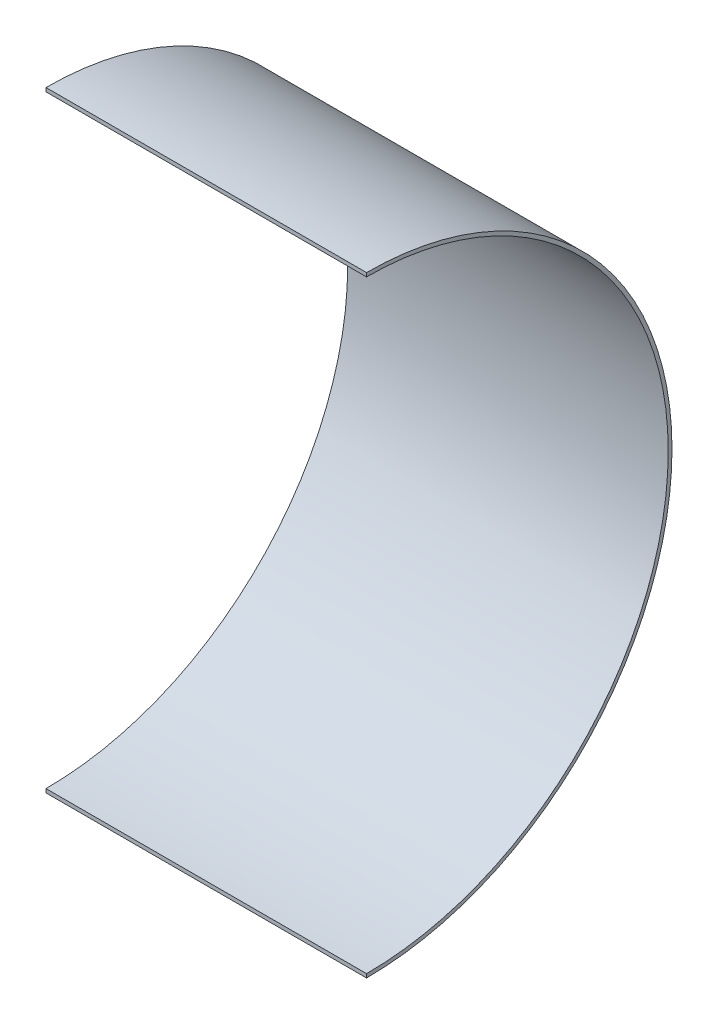
ISO-10303-21;
HEADER;
FILE_DESCRIPTION(('STEP AP214'),'2;1');
FILE_NAME('part.step','',(''),(''),'','','');
FILE_SCHEMA(('AUTOMOTIVE_DESIGN { 1 0 10303 214 1 1 1 1 }'));
ENDSEC;
DATA;
#1=APPLICATION_CONTEXT('core data for automotive mechanical design processes');
#2=APPLICATION_PROTOCOL_DEFINITION('international standard','automotive_design',2000,#1);
#3=PRODUCT_CONTEXT('',#1,'mechanical');
#4=PRODUCT('Part','Part','',(#3));
#5=PRODUCT_RELATED_PRODUCT_CATEGORY('part','',(#4));
#6=PRODUCT_DEFINITION_FORMATION('','',#4);
#7=PRODUCT_DEFINITION_CONTEXT('part definition',#1,'design');
#8=PRODUCT_DEFINITION('design','',#6,#7);
#9=PRODUCT_DEFINITION_SHAPE('','',#8);
#10=(LENGTH_UNIT() NAMED_UNIT(*) SI_UNIT(.MILLI.,.METRE.));
#11=(NAMED_UNIT(*) PLANE_ANGLE_UNIT() SI_UNIT($,.RADIAN.));
#12=(NAMED_UNIT(*) SI_UNIT($,.STERADIAN.) SOLID_ANGLE_UNIT());
#13=UNCERTAINTY_MEASURE_WITH_UNIT(LENGTH_MEASURE(1.E-05),#10,'distance_accuracy_value','');
#14=(GEOMETRIC_REPRESENTATION_CONTEXT(3) GLOBAL_UNCERTAINTY_ASSIGNED_CONTEXT((#13)) GLOBAL_UNIT_ASSIGNED_CONTEXT((#10,
#11,#12)) REPRESENTATION_CONTEXT('',''));
#15=CARTESIAN_POINT('',(0.,0.,0.));
#16=DIRECTION('',(0.,0.,1.));
#17=DIRECTION('',(1.,0.,0.));
#18=AXIS2_PLACEMENT_3D('',#15,#16,#17);
#19=CARTESIAN_POINT('',(215.9,0.,0.));
#20=DIRECTION('',(-1.,0.,0.));
#21=DIRECTION('',(0.,0.,1.));
#22=AXIS2_PLACEMENT_3D('',#19,#20,#21);
#23=CYLINDRICAL_SURFACE('',#22,205.74);
#24=CARTESIAN_POINT('',(0.,0.,0.));
#25=DIRECTION('',(1.,0.,0.));
#26=DIRECTION('',(0.,0.,-1.));
#27=AXIS2_PLACEMENT_3D('',#24,#25,#26);
#28=CIRCLE('',#27,205.74);
#29=CARTESIAN_POINT('',(0.,-205.74,0.));
#30=VERTEX_POINT('',#29);
#31=CARTESIAN_POINT('',(0.,205.74,0.));
#32=VERTEX_POINT('',#31);
#33=EDGE_CURVE('E95',#30,#32,#28,.T.);
#34=ORIENTED_EDGE('',*,*,#33,.T.);
#35=DIRECTION('',(-1.,0.,0.));
#36=VECTOR('',#35,1.);
#37=CARTESIAN_POINT('',(215.9,205.74,0.));
#38=LINE('',#37,#36);
#39=CARTESIAN_POINT('',(215.9,205.74,0.));
#40=VERTEX_POINT('',#39);
#41=EDGE_CURVE('E11',#40,#32,#38,.T.);
#42=ORIENTED_EDGE('',*,*,#41,.F.);
#43=CARTESIAN_POINT('',(215.9,0.,0.));
#44=DIRECTION('',(1.,0.,0.));
#45=DIRECTION('',(0.,0.,-1.));
#46=AXIS2_PLACEMENT_3D('',#43,#44,#45);
#47=CIRCLE('',#46,205.74);
#48=CARTESIAN_POINT('',(215.9,-205.74,0.));
#49=VERTEX_POINT('',#48);
#50=EDGE_CURVE('E72',#49,#40,#47,.T.);
#51=ORIENTED_EDGE('',*,*,#50,.F.);
#52=DIRECTION('',(-1.,0.,0.));
#53=VECTOR('',#52,1.);
#54=CARTESIAN_POINT('',(215.9,-205.74,0.));
#55=LINE('',#54,#53);
#56=EDGE_CURVE('E48',#49,#30,#55,.T.);
#57=ORIENTED_EDGE('',*,*,#56,.T.);
#58=EDGE_LOOP('',(#34,#42,#51,#57));
#59=FACE_BOUND('',#58,.T.);
#60=ADVANCED_FACE('F32',(#59),#23,.T.);
#61=CARTESIAN_POINT('',(215.9,203.2,0.));
#62=DIRECTION('',(0.,0.,1.));
#63=DIRECTION('',(0.,-1.,0.));
#64=AXIS2_PLACEMENT_3D('',#61,#62,#63);
#65=PLANE('',#64);
#66=DIRECTION('',(0.,1.,0.));
#67=VECTOR('',#66,1.);
#68=CARTESIAN_POINT('',(0.,203.2,0.));
#69=LINE('',#68,#67);
#70=CARTESIAN_POINT('',(0.,203.2,0.));
#71=VERTEX_POINT('',#70);
#72=EDGE_CURVE('E81',#71,#32,#69,.T.);
#73=ORIENTED_EDGE('',*,*,#72,.F.);
#74=DIRECTION('',(-1.,0.,0.));
#75=VECTOR('',#74,1.);
#76=CARTESIAN_POINT('',(215.9,203.2,0.));
#77=LINE('',#76,#75);
#78=CARTESIAN_POINT('',(215.9,203.2,0.));
#79=VERTEX_POINT('',#78);
#80=EDGE_CURVE('E40',#79,#71,#77,.T.);
#81=ORIENTED_EDGE('',*,*,#80,.F.);
#82=DIRECTION('',(0.,1.,0.));
#83=VECTOR('',#82,1.);
#84=CARTESIAN_POINT('',(215.9,203.2,0.));
#85=LINE('',#84,#83);
#86=EDGE_CURVE('E79',#79,#40,#85,.T.);
#87=ORIENTED_EDGE('',*,*,#86,.T.);
#88=ORIENTED_EDGE('',*,*,#41,.T.);
#89=EDGE_LOOP('',(#73,#81,#87,#88));
#90=FACE_BOUND('',#89,.T.);
#91=ADVANCED_FACE('F78',(#90),#65,.T.);
#92=CARTESIAN_POINT('',(215.9,0.,0.));
#93=DIRECTION('',(-1.,0.,0.));
#94=DIRECTION('',(0.,0.,1.));
#95=AXIS2_PLACEMENT_3D('',#92,#93,#94);
#96=CYLINDRICAL_SURFACE('',#95,203.2);
#97=CARTESIAN_POINT('',(0.,0.,0.));
#98=DIRECTION('',(1.,0.,0.));
#99=DIRECTION('',(0.,0.,-1.));
#100=AXIS2_PLACEMENT_3D('',#97,#98,#99);
#101=CIRCLE('',#100,203.2);
#102=CARTESIAN_POINT('',(0.,-203.2,0.));
#103=VERTEX_POINT('',#102);
#104=EDGE_CURVE('E98',#103,#71,#101,.T.);
#105=ORIENTED_EDGE('',*,*,#104,.F.);
#106=DIRECTION('',(-1.,0.,0.));
#107=VECTOR('',#106,1.);
#108=CARTESIAN_POINT('',(215.9,-203.2,0.));
#109=LINE('',#108,#107);
#110=CARTESIAN_POINT('',(215.9,-203.2,0.));
#111=VERTEX_POINT('',#110);
#112=EDGE_CURVE('E61',#111,#103,#109,.T.);
#113=ORIENTED_EDGE('',*,*,#112,.F.);
#114=CARTESIAN_POINT('',(215.9,0.,0.));
#115=DIRECTION('',(1.,0.,0.));
#116=DIRECTION('',(0.,0.,-1.));
#117=AXIS2_PLACEMENT_3D('',#114,#115,#116);
#118=CIRCLE('',#117,203.2);
#119=EDGE_CURVE('E87',#111,#79,#118,.T.);
#120=ORIENTED_EDGE('',*,*,#119,.T.);
#121=ORIENTED_EDGE('',*,*,#80,.T.);
#122=EDGE_LOOP('',(#105,#113,#120,#121));
#123=FACE_BOUND('',#122,.T.);
#124=ADVANCED_FACE('F89',(#123),#96,.F.);
#125=CARTESIAN_POINT('',(215.9,-205.74,0.));
#126=DIRECTION('',(0.,0.,1.));
#127=DIRECTION('',(0.,-1.,0.));
#128=AXIS2_PLACEMENT_3D('',#125,#126,#127);
#129=PLANE('',#128);
#130=DIRECTION('',(0.,1.,0.));
#131=VECTOR('',#130,1.);
#132=CARTESIAN_POINT('',(0.,-205.74,0.));
#133=LINE('',#132,#131);
#134=EDGE_CURVE('E100',#30,#103,#133,.T.);
#135=ORIENTED_EDGE('',*,*,#134,.F.);
#136=ORIENTED_EDGE('',*,*,#56,.F.);
#137=DIRECTION('',(0.,1.,0.));
#138=VECTOR('',#137,1.);
#139=CARTESIAN_POINT('',(215.9,-205.74,0.));
#140=LINE('',#139,#138);
#141=EDGE_CURVE('E90',#49,#111,#140,.T.);
#142=ORIENTED_EDGE('',*,*,#141,.T.);
#143=ORIENTED_EDGE('',*,*,#112,.T.);
#144=EDGE_LOOP('',(#135,#136,#142,#143));
#145=FACE_BOUND('',#144,.T.);
#146=ADVANCED_FACE('F106',(#145),#129,.T.);
#147=CARTESIAN_POINT('',(215.9,0.,0.));
#148=DIRECTION('',(1.,0.,0.));
#149=DIRECTION('',(0.,0.,-1.));
#150=AXIS2_PLACEMENT_3D('',#147,#148,#149);
#151=PLANE('',#150);
#152=ORIENTED_EDGE('',*,*,#50,.T.);
#153=ORIENTED_EDGE('',*,*,#86,.F.);
#154=ORIENTED_EDGE('',*,*,#119,.F.);
#155=ORIENTED_EDGE('',*,*,#141,.F.);
#156=EDGE_LOOP('',(#152,#153,#154,#155));
#157=FACE_BOUND('',#156,.T.);
#158=ADVANCED_FACE('F86',(#157),#151,.T.);
#159=CARTESIAN_POINT('',(0.,0.,0.));
#160=DIRECTION('',(1.,0.,0.));
#161=DIRECTION('',(0.,0.,-1.));
#162=AXIS2_PLACEMENT_3D('',#159,#160,#161);
#163=PLANE('',#162);
#164=ORIENTED_EDGE('',*,*,#33,.F.);
#165=ORIENTED_EDGE('',*,*,#134,.T.);
#166=ORIENTED_EDGE('',*,*,#104,.T.);
#167=ORIENTED_EDGE('',*,*,#72,.T.);
#168=EDGE_LOOP('',(#164,#165,#166,#167));
#169=FACE_BOUND('',#168,.T.);
#170=ADVANCED_FACE('F105',(#169),#163,.F.);
#171=CLOSED_SHELL('',(#60,#91,#124,#146,#158,#170));
#172=MANIFOLD_SOLID_BREP('B2',#171);
#173=ADVANCED_BREP_SHAPE_REPRESENTATION('',(#18,#172),#14);
#174=SHAPE_DEFINITION_REPRESENTATION(#9,#173);
ENDSEC;
END-ISO-10303-21;
